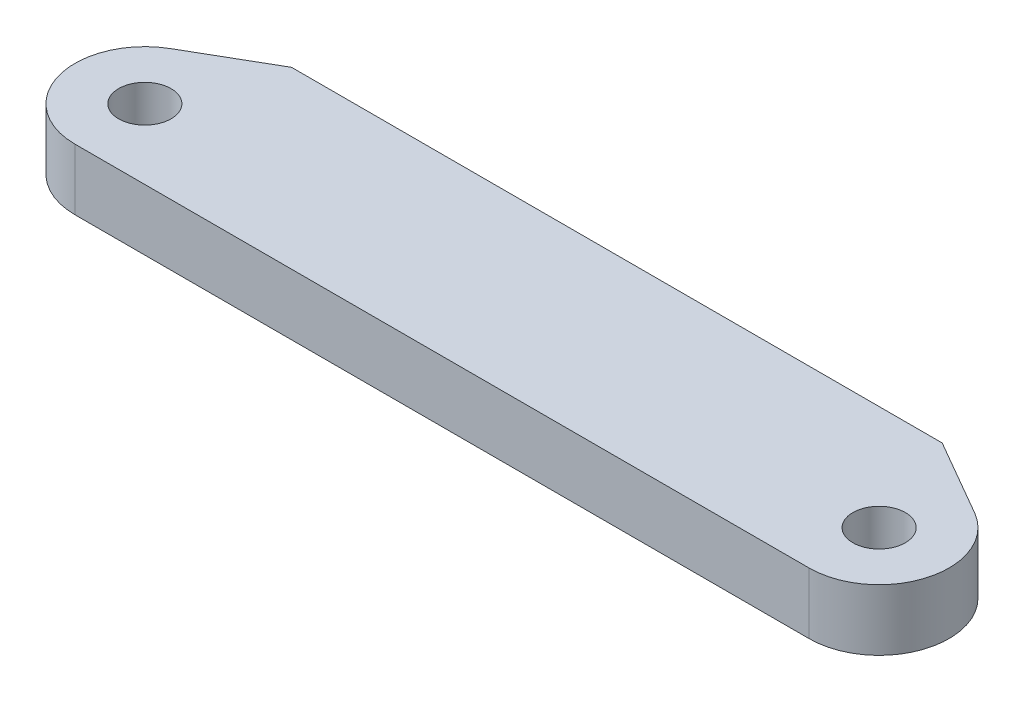
ISO-10303-21;
HEADER;
FILE_DESCRIPTION(('STEP AP214'),'2;1');
FILE_NAME('part.step','',(''),(''),'','','');
FILE_SCHEMA(('AUTOMOTIVE_DESIGN { 1 0 10303 214 1 1 1 1 }'));
ENDSEC;
DATA;
#1=APPLICATION_CONTEXT('core data for automotive mechanical design processes');
#2=APPLICATION_PROTOCOL_DEFINITION('international standard','automotive_design',2000,#1);
#3=PRODUCT_CONTEXT('',#1,'mechanical');
#4=PRODUCT('Part','Part','',(#3));
#5=PRODUCT_RELATED_PRODUCT_CATEGORY('part','',(#4));
#6=PRODUCT_DEFINITION_FORMATION('','',#4);
#7=PRODUCT_DEFINITION_CONTEXT('part definition',#1,'design');
#8=PRODUCT_DEFINITION('design','',#6,#7);
#9=PRODUCT_DEFINITION_SHAPE('','',#8);
#10=(LENGTH_UNIT() NAMED_UNIT(*) SI_UNIT(.MILLI.,.METRE.));
#11=(NAMED_UNIT(*) PLANE_ANGLE_UNIT() SI_UNIT($,.RADIAN.));
#12=(NAMED_UNIT(*) SI_UNIT($,.STERADIAN.) SOLID_ANGLE_UNIT());
#13=UNCERTAINTY_MEASURE_WITH_UNIT(LENGTH_MEASURE(1.E-05),#10,'distance_accuracy_value','');
#14=(GEOMETRIC_REPRESENTATION_CONTEXT(3) GLOBAL_UNCERTAINTY_ASSIGNED_CONTEXT((#13)) GLOBAL_UNIT_ASSIGNED_CONTEXT((#10,
#11,#12)) REPRESENTATION_CONTEXT('',''));
#15=CARTESIAN_POINT('',(0.,0.,0.));
#16=DIRECTION('',(0.,0.,1.));
#17=DIRECTION('',(1.,0.,0.));
#18=AXIS2_PLACEMENT_3D('',#15,#16,#17);
#19=CARTESIAN_POINT('',(18.6076951545868,3.5,-5.));
#20=DIRECTION('',(-0.50000000000001,0.,0.866025403784433));
#21=DIRECTION('',(0.866025403784433,0.,0.50000000000001));
#22=AXIS2_PLACEMENT_3D('',#19,#20,#21);
#23=PLANE('',#22);
#24=DIRECTION('',(-0.866025403784433,0.,-0.50000000000001));
#25=VECTOR('',#24,1.);
#26=CARTESIAN_POINT('',(18.6076951545868,0.,-5.));
#27=LINE('',#26,#25);
#28=CARTESIAN_POINT('',(23.,0.,-2.46410161513773));
#29=VERTEX_POINT('',#28);
#30=CARTESIAN_POINT('',(18.6076951545868,0.,-5.));
#31=VERTEX_POINT('',#30);
#32=EDGE_CURVE('E117',#29,#31,#27,.T.);
#33=ORIENTED_EDGE('',*,*,#32,.T.);
#34=DIRECTION('',(0.,-1.,0.));
#35=VECTOR('',#34,1.);
#36=CARTESIAN_POINT('',(18.6076951545868,3.5,-5.));
#37=LINE('',#36,#35);
#38=CARTESIAN_POINT('',(18.6076951545868,3.5,-5.));
#39=VERTEX_POINT('',#38);
#40=EDGE_CURVE('E11',#39,#31,#37,.T.);
#41=ORIENTED_EDGE('',*,*,#40,.F.);
#42=DIRECTION('',(-0.866025403784433,0.,-0.50000000000001));
#43=VECTOR('',#42,1.);
#44=CARTESIAN_POINT('',(18.6076951545868,3.5,-5.));
#45=LINE('',#44,#43);
#46=CARTESIAN_POINT('',(23.,3.5,-2.46410161513773));
#47=VERTEX_POINT('',#46);
#48=EDGE_CURVE('E128',#47,#39,#45,.T.);
#49=ORIENTED_EDGE('',*,*,#48,.F.);
#50=DIRECTION('',(0.,-1.,0.));
#51=VECTOR('',#50,1.);
#52=CARTESIAN_POINT('',(23.,3.5,-2.46410161513773));
#53=LINE('',#52,#51);
#54=EDGE_CURVE('E113',#47,#29,#53,.T.);
#55=ORIENTED_EDGE('',*,*,#54,.T.);
#56=EDGE_LOOP('',(#33,#41,#49,#55));
#57=FACE_BOUND('',#56,.T.);
#58=ADVANCED_FACE('F33',(#57),#23,.F.);
#59=CARTESIAN_POINT('',(-18.6076951545868,3.5,-5.));
#60=DIRECTION('',(0.,0.,1.));
#61=DIRECTION('',(1.,0.,0.));
#62=AXIS2_PLACEMENT_3D('',#59,#60,#61);
#63=PLANE('',#62);
#64=DIRECTION('',(-1.,0.,0.));
#65=VECTOR('',#64,1.);
#66=CARTESIAN_POINT('',(-18.6076951545868,0.,-5.));
#67=LINE('',#66,#65);
#68=CARTESIAN_POINT('',(-18.6076951545868,0.,-5.));
#69=VERTEX_POINT('',#68);
#70=EDGE_CURVE('E120',#31,#69,#67,.T.);
#71=ORIENTED_EDGE('',*,*,#70,.T.);
#72=DIRECTION('',(0.,-1.,0.));
#73=VECTOR('',#72,1.);
#74=CARTESIAN_POINT('',(-18.6076951545868,3.5,-5.));
#75=LINE('',#74,#73);
#76=CARTESIAN_POINT('',(-18.6076951545868,3.5,-5.));
#77=VERTEX_POINT('',#76);
#78=EDGE_CURVE('E41',#77,#69,#75,.T.);
#79=ORIENTED_EDGE('',*,*,#78,.F.);
#80=DIRECTION('',(-1.,0.,0.));
#81=VECTOR('',#80,1.);
#82=CARTESIAN_POINT('',(-18.6076951545868,3.5,-5.));
#83=LINE('',#82,#81);
#84=EDGE_CURVE('E85',#39,#77,#83,.T.);
#85=ORIENTED_EDGE('',*,*,#84,.F.);
#86=ORIENTED_EDGE('',*,*,#40,.T.);
#87=EDGE_LOOP('',(#71,#79,#85,#86));
#88=FACE_BOUND('',#87,.T.);
#89=ADVANCED_FACE('F153',(#88),#63,.F.);
#90=CARTESIAN_POINT('',(-18.6076951545868,3.5,-5.));
#91=DIRECTION('',(0.50000000000001,0.,0.866025403784433));
#92=DIRECTION('',(0.866025403784433,0.,-0.50000000000001));
#93=AXIS2_PLACEMENT_3D('',#90,#91,#92);
#94=PLANE('',#93);
#95=DIRECTION('',(-0.866025403784432,0.,0.50000000000001));
#96=VECTOR('',#95,1.);
#97=CARTESIAN_POINT('',(-18.6076951545868,0.,-5.));
#98=LINE('',#97,#96);
#99=CARTESIAN_POINT('',(-23.,0.,-2.46410161513774));
#100=VERTEX_POINT('',#99);
#101=EDGE_CURVE('E123',#69,#100,#98,.T.);
#102=ORIENTED_EDGE('',*,*,#101,.T.);
#103=DIRECTION('',(0.,-1.,0.));
#104=VECTOR('',#103,1.);
#105=CARTESIAN_POINT('',(-23.,3.5,-2.46410161513774));
#106=LINE('',#105,#104);
#107=CARTESIAN_POINT('',(-23.,3.5,-2.46410161513774));
#108=VERTEX_POINT('',#107);
#109=EDGE_CURVE('E108',#108,#100,#106,.T.);
#110=ORIENTED_EDGE('',*,*,#109,.F.);
#111=DIRECTION('',(-0.866025403784432,0.,0.50000000000001));
#112=VECTOR('',#111,1.);
#113=CARTESIAN_POINT('',(-18.6076951545868,3.5,-5.));
#114=LINE('',#113,#112);
#115=EDGE_CURVE('E98',#77,#108,#114,.T.);
#116=ORIENTED_EDGE('',*,*,#115,.F.);
#117=ORIENTED_EDGE('',*,*,#78,.T.);
#118=EDGE_LOOP('',(#102,#110,#116,#117));
#119=FACE_BOUND('',#118,.T.);
#120=ADVANCED_FACE('F134',(#119),#94,.F.);
#121=CARTESIAN_POINT('',(-21.,3.5,0.999999999999994));
#122=DIRECTION('',(0.,-1.,0.));
#123=DIRECTION('',(0.,0.,-1.));
#124=AXIS2_PLACEMENT_3D('',#121,#122,#123);
#125=CYLINDRICAL_SURFACE('',#124,4.);
#126=CARTESIAN_POINT('',(-21.,0.,0.999999999999994));
#127=DIRECTION('',(0.,1.,0.));
#128=DIRECTION('',(0.,0.,1.));
#129=AXIS2_PLACEMENT_3D('',#126,#127,#128);
#130=CIRCLE('',#129,4.);
#131=CARTESIAN_POINT('',(-21.,0.,5.));
#132=VERTEX_POINT('',#131);
#133=EDGE_CURVE('E107',#100,#132,#130,.T.);
#134=ORIENTED_EDGE('',*,*,#133,.T.);
#135=DIRECTION('',(0.,-1.,0.));
#136=VECTOR('',#135,1.);
#137=CARTESIAN_POINT('',(-21.,3.5,5.));
#138=LINE('',#137,#136);
#139=CARTESIAN_POINT('',(-21.,3.5,5.));
#140=VERTEX_POINT('',#139);
#141=EDGE_CURVE('E104',#140,#132,#138,.T.);
#142=ORIENTED_EDGE('',*,*,#141,.F.);
#143=CARTESIAN_POINT('',(-21.,3.5,0.999999999999994));
#144=DIRECTION('',(0.,1.,0.));
#145=DIRECTION('',(0.,0.,1.));
#146=AXIS2_PLACEMENT_3D('',#143,#144,#145);
#147=CIRCLE('',#146,4.);
#148=EDGE_CURVE('E92',#108,#140,#147,.T.);
#149=ORIENTED_EDGE('',*,*,#148,.F.);
#150=ORIENTED_EDGE('',*,*,#109,.T.);
#151=EDGE_LOOP('',(#134,#142,#149,#150));
#152=FACE_BOUND('',#151,.T.);
#153=ADVANCED_FACE('F105',(#152),#125,.T.);
#154=CARTESIAN_POINT('',(21.,3.5,5.));
#155=DIRECTION('',(0.,0.,-1.));
#156=DIRECTION('',(-1.,0.,0.));
#157=AXIS2_PLACEMENT_3D('',#154,#155,#156);
#158=PLANE('',#157);
#159=DIRECTION('',(1.,0.,0.));
#160=VECTOR('',#159,1.);
#161=CARTESIAN_POINT('',(21.,0.,5.));
#162=LINE('',#161,#160);
#163=CARTESIAN_POINT('',(21.,0.,5.));
#164=VERTEX_POINT('',#163);
#165=EDGE_CURVE('E71',#132,#164,#162,.T.);
#166=ORIENTED_EDGE('',*,*,#165,.T.);
#167=DIRECTION('',(0.,-1.,0.));
#168=VECTOR('',#167,1.);
#169=CARTESIAN_POINT('',(21.,3.5,5.));
#170=LINE('',#169,#168);
#171=CARTESIAN_POINT('',(21.,3.5,5.));
#172=VERTEX_POINT('',#171);
#173=EDGE_CURVE('E109',#172,#164,#170,.T.);
#174=ORIENTED_EDGE('',*,*,#173,.F.);
#175=DIRECTION('',(1.,0.,0.));
#176=VECTOR('',#175,1.);
#177=CARTESIAN_POINT('',(-21.,3.5,5.00000000000001));
#178=LINE('',#177,#176);
#179=EDGE_CURVE('E96',#140,#172,#178,.T.);
#180=ORIENTED_EDGE('',*,*,#179,.F.);
#181=ORIENTED_EDGE('',*,*,#141,.T.);
#182=EDGE_LOOP('',(#166,#174,#180,#181));
#183=FACE_BOUND('',#182,.T.);
#184=ADVANCED_FACE('F111',(#183),#158,.F.);
#185=CARTESIAN_POINT('',(21.,3.5,1.));
#186=DIRECTION('',(0.,-1.,0.));
#187=DIRECTION('',(0.,0.,-1.));
#188=AXIS2_PLACEMENT_3D('',#185,#186,#187);
#189=CYLINDRICAL_SURFACE('',#188,4.);
#190=CARTESIAN_POINT('',(21.,0.,1.));
#191=DIRECTION('',(0.,1.,0.));
#192=DIRECTION('',(0.,0.,-1.));
#193=AXIS2_PLACEMENT_3D('',#190,#191,#192);
#194=CIRCLE('',#193,4.);
#195=EDGE_CURVE('E77',#164,#29,#194,.T.);
#196=ORIENTED_EDGE('',*,*,#195,.T.);
#197=ORIENTED_EDGE('',*,*,#54,.F.);
#198=CARTESIAN_POINT('',(21.,3.5,1.));
#199=DIRECTION('',(0.,1.,0.));
#200=DIRECTION('',(0.,0.,-1.));
#201=AXIS2_PLACEMENT_3D('',#198,#199,#200);
#202=CIRCLE('',#201,4.);
#203=EDGE_CURVE('E49',#172,#47,#202,.T.);
#204=ORIENTED_EDGE('',*,*,#203,.F.);
#205=ORIENTED_EDGE('',*,*,#173,.T.);
#206=EDGE_LOOP('',(#196,#197,#204,#205));
#207=FACE_BOUND('',#206,.T.);
#208=ADVANCED_FACE('F141',(#207),#189,.T.);
#209=CARTESIAN_POINT('',(21.,3.5,1.));
#210=DIRECTION('',(0.,-1.,0.));
#211=DIRECTION('',(0.,0.,-1.));
#212=AXIS2_PLACEMENT_3D('',#209,#210,#211);
#213=PLANE('',#212);
#214=CARTESIAN_POINT('',(21.,3.5,1.));
#215=DIRECTION('',(0.,1.,0.));
#216=DIRECTION('',(0.,0.,1.));
#217=AXIS2_PLACEMENT_3D('',#214,#215,#216);
#218=CIRCLE('',#217,1.5);
#219=CARTESIAN_POINT('',(21.,3.5,2.5));
#220=VERTEX_POINT('',#219);
#221=EDGE_CURVE('E220',#220,#220,#218,.T.);
#222=ORIENTED_EDGE('',*,*,#221,.F.);
#223=EDGE_LOOP('',(#222));
#224=FACE_BOUND('',#223,.T.);
#225=CARTESIAN_POINT('',(-21.,3.5,0.999999999999994));
#226=DIRECTION('',(0.,1.,0.));
#227=DIRECTION('',(0.,0.,1.));
#228=AXIS2_PLACEMENT_3D('',#225,#226,#227);
#229=CIRCLE('',#228,1.5);
#230=CARTESIAN_POINT('',(-21.,3.5,2.49999999999999));
#231=VERTEX_POINT('',#230);
#232=EDGE_CURVE('E222',#231,#231,#229,.T.);
#233=ORIENTED_EDGE('',*,*,#232,.F.);
#234=EDGE_LOOP('',(#233));
#235=FACE_BOUND('',#234,.T.);
#236=ORIENTED_EDGE('',*,*,#48,.T.);
#237=ORIENTED_EDGE('',*,*,#84,.T.);
#238=ORIENTED_EDGE('',*,*,#115,.T.);
#239=ORIENTED_EDGE('',*,*,#148,.T.);
#240=ORIENTED_EDGE('',*,*,#179,.T.);
#241=ORIENTED_EDGE('',*,*,#203,.T.);
#242=EDGE_LOOP('',(#236,#237,#238,#239,#240,#241));
#243=FACE_BOUND('',#242,.T.);
#244=ADVANCED_FACE('F94',(#224,#235,#243),#213,.F.);
#245=CARTESIAN_POINT('',(21.,0.,1.));
#246=DIRECTION('',(0.,-1.,0.));
#247=DIRECTION('',(0.,0.,-1.));
#248=AXIS2_PLACEMENT_3D('',#245,#246,#247);
#249=PLANE('',#248);
#250=CARTESIAN_POINT('',(21.,0.,1.));
#251=DIRECTION('',(0.,1.,0.));
#252=DIRECTION('',(0.,0.,1.));
#253=AXIS2_PLACEMENT_3D('',#250,#251,#252);
#254=CIRCLE('',#253,1.5);
#255=CARTESIAN_POINT('',(21.,0.,2.5));
#256=VERTEX_POINT('',#255);
#257=EDGE_CURVE('E217',#256,#256,#254,.T.);
#258=ORIENTED_EDGE('',*,*,#257,.T.);
#259=EDGE_LOOP('',(#258));
#260=FACE_BOUND('',#259,.T.);
#261=CARTESIAN_POINT('',(-21.,0.,0.999999999999994));
#262=DIRECTION('',(0.,1.,0.));
#263=DIRECTION('',(0.,0.,1.));
#264=AXIS2_PLACEMENT_3D('',#261,#262,#263);
#265=CIRCLE('',#264,1.5);
#266=CARTESIAN_POINT('',(-21.,0.,2.49999999999999));
#267=VERTEX_POINT('',#266);
#268=EDGE_CURVE('E121',#267,#267,#265,.T.);
#269=ORIENTED_EDGE('',*,*,#268,.T.);
#270=EDGE_LOOP('',(#269));
#271=FACE_BOUND('',#270,.T.);
#272=ORIENTED_EDGE('',*,*,#32,.F.);
#273=ORIENTED_EDGE('',*,*,#195,.F.);
#274=ORIENTED_EDGE('',*,*,#165,.F.);
#275=ORIENTED_EDGE('',*,*,#133,.F.);
#276=ORIENTED_EDGE('',*,*,#101,.F.);
#277=ORIENTED_EDGE('',*,*,#70,.F.);
#278=EDGE_LOOP('',(#272,#273,#274,#275,#276,#277));
#279=FACE_BOUND('',#278,.T.);
#280=ADVANCED_FACE('F137',(#260,#271,#279),#249,.T.);
#281=CARTESIAN_POINT('',(-21.,0.,0.999999999999994));
#282=DIRECTION('',(0.,1.,0.));
#283=DIRECTION('',(0.,0.,1.));
#284=AXIS2_PLACEMENT_3D('',#281,#282,#283);
#285=CYLINDRICAL_SURFACE('',#284,1.5);
#286=ORIENTED_EDGE('',*,*,#268,.F.);
#287=EDGE_LOOP('',(#286));
#288=FACE_BOUND('',#287,.T.);
#289=ORIENTED_EDGE('',*,*,#232,.T.);
#290=EDGE_LOOP('',(#289));
#291=FACE_BOUND('',#290,.T.);
#292=ADVANCED_FACE('F191',(#288,#291),#285,.F.);
#293=CARTESIAN_POINT('',(21.,0.,1.));
#294=DIRECTION('',(0.,1.,0.));
#295=DIRECTION('',(0.,0.,1.));
#296=AXIS2_PLACEMENT_3D('',#293,#294,#295);
#297=CYLINDRICAL_SURFACE('',#296,1.5);
#298=ORIENTED_EDGE('',*,*,#257,.F.);
#299=EDGE_LOOP('',(#298));
#300=FACE_BOUND('',#299,.T.);
#301=ORIENTED_EDGE('',*,*,#221,.T.);
#302=EDGE_LOOP('',(#301));
#303=FACE_BOUND('',#302,.T.);
#304=ADVANCED_FACE('F200',(#300,#303),#297,.F.);
#305=CLOSED_SHELL('',(#58,#89,#120,#153,#184,#208,#244,#280,#292,#304));
#306=MANIFOLD_SOLID_BREP('B2',#305);
#307=ADVANCED_BREP_SHAPE_REPRESENTATION('',(#18,#306),#14);
#308=SHAPE_DEFINITION_REPRESENTATION(#9,#307);
ENDSEC;
END-ISO-10303-21;
